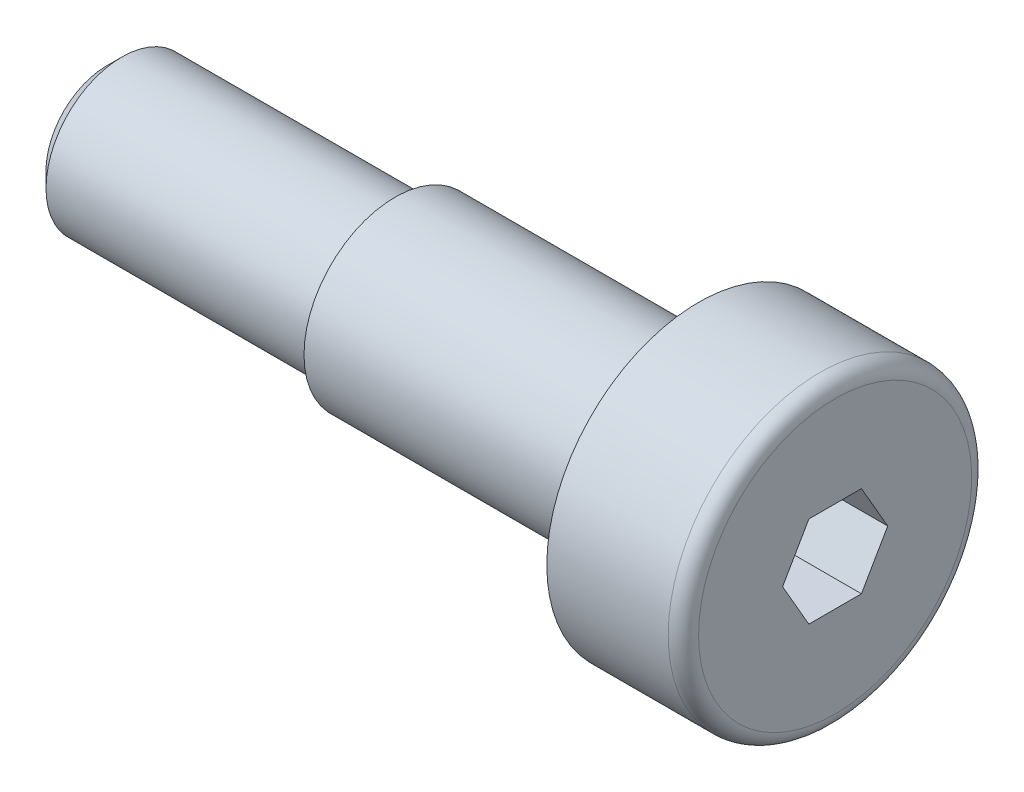
ISO-10303-21;
HEADER;
FILE_DESCRIPTION(('STEP AP214'),'2;1');
FILE_NAME('part.step','',(''),(''),'','','');
FILE_SCHEMA(('AUTOMOTIVE_DESIGN { 1 0 10303 214 1 1 1 1 }'));
ENDSEC;
DATA;
#1=APPLICATION_CONTEXT('core data for automotive mechanical design processes');
#2=APPLICATION_PROTOCOL_DEFINITION('international standard','automotive_design',2000,#1);
#3=PRODUCT_CONTEXT('',#1,'mechanical');
#4=PRODUCT('Part','Part','',(#3));
#5=PRODUCT_RELATED_PRODUCT_CATEGORY('part','',(#4));
#6=PRODUCT_DEFINITION_FORMATION('','',#4);
#7=PRODUCT_DEFINITION_CONTEXT('part definition',#1,'design');
#8=PRODUCT_DEFINITION('design','',#6,#7);
#9=PRODUCT_DEFINITION_SHAPE('','',#8);
#10=(LENGTH_UNIT() NAMED_UNIT(*) SI_UNIT(.MILLI.,.METRE.));
#11=(NAMED_UNIT(*) PLANE_ANGLE_UNIT() SI_UNIT($,.RADIAN.));
#12=(NAMED_UNIT(*) SI_UNIT($,.STERADIAN.) SOLID_ANGLE_UNIT());
#13=UNCERTAINTY_MEASURE_WITH_UNIT(LENGTH_MEASURE(1.E-05),#10,'distance_accuracy_value','');
#14=(GEOMETRIC_REPRESENTATION_CONTEXT(3) GLOBAL_UNCERTAINTY_ASSIGNED_CONTEXT((#13)) GLOBAL_UNIT_ASSIGNED_CONTEXT((#10,
#11,#12)) REPRESENTATION_CONTEXT('',''));
#15=CARTESIAN_POINT('',(0.,0.,0.));
#16=DIRECTION('',(0.,0.,1.));
#17=DIRECTION('',(1.,0.,0.));
#18=AXIS2_PLACEMENT_3D('',#15,#16,#17);
#19=CARTESIAN_POINT('',(0.,0.,0.));
#20=DIRECTION('',(-1.,0.,0.));
#21=DIRECTION('',(0.,0.,1.));
#22=AXIS2_PLACEMENT_3D('',#19,#20,#21);
#23=PLANE('',#22);
#24=DIRECTION('',(0.,0.866025403784439,0.5));
#25=VECTOR('',#24,1.);
#26=CARTESIAN_POINT('',(0.,0.,-1.73205080756888));
#27=LINE('',#26,#25);
#28=CARTESIAN_POINT('',(0.,0.,-1.73205080756888));
#29=VERTEX_POINT('',#28);
#30=CARTESIAN_POINT('',(0.,1.5,-0.866025403784438));
#31=VERTEX_POINT('',#30);
#32=EDGE_CURVE('E124',#29,#31,#27,.T.);
#33=ORIENTED_EDGE('',*,*,#32,.F.);
#34=DIRECTION('',(0.,0.866025403784439,-0.5));
#35=VECTOR('',#34,1.);
#36=CARTESIAN_POINT('',(0.,-1.5,-0.866025403784439));
#37=LINE('',#36,#35);
#38=CARTESIAN_POINT('',(0.,-1.5,-0.866025403784439));
#39=VERTEX_POINT('',#38);
#40=EDGE_CURVE('E50',#39,#29,#37,.T.);
#41=ORIENTED_EDGE('',*,*,#40,.F.);
#42=DIRECTION('',(0.,0.,-1.));
#43=VECTOR('',#42,1.);
#44=CARTESIAN_POINT('',(0.,-1.5,0.866025403784438));
#45=LINE('',#44,#43);
#46=CARTESIAN_POINT('',(0.,-1.5,0.866025403784438));
#47=VERTEX_POINT('',#46);
#48=EDGE_CURVE('E133',#47,#39,#45,.T.);
#49=ORIENTED_EDGE('',*,*,#48,.F.);
#50=DIRECTION('',(0.,-0.866025403784439,-0.5));
#51=VECTOR('',#50,1.);
#52=CARTESIAN_POINT('',(0.,0.,1.73205080756888));
#53=LINE('',#52,#51);
#54=CARTESIAN_POINT('',(0.,0.,1.73205080756888));
#55=VERTEX_POINT('',#54);
#56=EDGE_CURVE('E131',#55,#47,#53,.T.);
#57=ORIENTED_EDGE('',*,*,#56,.F.);
#58=DIRECTION('',(0.,-0.866025403784439,0.5));
#59=VECTOR('',#58,1.);
#60=CARTESIAN_POINT('',(0.,1.5,0.866025403784439));
#61=LINE('',#60,#59);
#62=CARTESIAN_POINT('',(0.,1.5,0.866025403784439));
#63=VERTEX_POINT('',#62);
#64=EDGE_CURVE('E98',#63,#55,#61,.T.);
#65=ORIENTED_EDGE('',*,*,#64,.F.);
#66=DIRECTION('',(0.,0.,1.));
#67=VECTOR('',#66,1.);
#68=CARTESIAN_POINT('',(0.,1.5,-0.866025403784438));
#69=LINE('',#68,#67);
#70=EDGE_CURVE('E127',#31,#63,#69,.T.);
#71=ORIENTED_EDGE('',*,*,#70,.F.);
#72=EDGE_LOOP('',(#33,#41,#49,#57,#65,#71));
#73=FACE_BOUND('',#72,.T.);
#74=CARTESIAN_POINT('',(0.,0.,0.));
#75=DIRECTION('',(-1.,0.,0.));
#76=DIRECTION('',(0.,0.,1.));
#77=AXIS2_PLACEMENT_3D('',#74,#75,#76);
#78=CIRCLE('',#77,4.5);
#79=CARTESIAN_POINT('',(0.,0.,4.5));
#80=VERTEX_POINT('',#79);
#81=EDGE_CURVE('E157',#80,#80,#78,.T.);
#82=ORIENTED_EDGE('',*,*,#81,.F.);
#83=EDGE_LOOP('',(#82));
#84=FACE_BOUND('',#83,.T.);
#85=ADVANCED_FACE('F35',(#73,#84),#23,.F.);
#86=CARTESIAN_POINT('',(-0.5,0.,0.));
#87=DIRECTION('',(-1.,0.,0.));
#88=DIRECTION('',(0.,0.,1.));
#89=AXIS2_PLACEMENT_3D('',#86,#87,#88);
#90=TOROIDAL_SURFACE('',#89,4.5,0.499999999999999);
#91=CARTESIAN_POINT('',(-0.5,0.,0.));
#92=DIRECTION('',(-1.,0.,0.));
#93=DIRECTION('',(0.,0.,1.));
#94=AXIS2_PLACEMENT_3D('',#91,#92,#93);
#95=CIRCLE('',#94,5.);
#96=CARTESIAN_POINT('',(-0.5,0.,5.));
#97=VERTEX_POINT('',#96);
#98=EDGE_CURVE('E154',#97,#97,#95,.T.);
#99=ORIENTED_EDGE('',*,*,#98,.F.);
#100=EDGE_LOOP('',(#99));
#101=FACE_BOUND('',#100,.T.);
#102=ORIENTED_EDGE('',*,*,#81,.T.);
#103=EDGE_LOOP('',(#102));
#104=FACE_BOUND('',#103,.T.);
#105=ADVANCED_FACE('F177',(#101,#104),#90,.T.);
#106=CARTESIAN_POINT('',(0.,0.,0.));
#107=DIRECTION('',(-1.,0.,0.));
#108=DIRECTION('',(0.,0.,1.));
#109=AXIS2_PLACEMENT_3D('',#106,#107,#108);
#110=CYLINDRICAL_SURFACE('',#109,5.);
#111=CARTESIAN_POINT('',(-4.5,0.,0.));
#112=DIRECTION('',(-1.,0.,0.));
#113=DIRECTION('',(0.,0.,1.));
#114=AXIS2_PLACEMENT_3D('',#111,#112,#113);
#115=CIRCLE('',#114,5.);
#116=CARTESIAN_POINT('',(-4.5,0.,5.));
#117=VERTEX_POINT('',#116);
#118=EDGE_CURVE('E151',#117,#117,#115,.T.);
#119=ORIENTED_EDGE('',*,*,#118,.F.);
#120=EDGE_LOOP('',(#119));
#121=FACE_BOUND('',#120,.T.);
#122=ORIENTED_EDGE('',*,*,#98,.T.);
#123=EDGE_LOOP('',(#122));
#124=FACE_BOUND('',#123,.T.);
#125=ADVANCED_FACE('F182',(#121,#124),#110,.T.);
#126=CARTESIAN_POINT('',(-4.5,5.,0.));
#127=DIRECTION('',(1.,0.,0.));
#128=DIRECTION('',(0.,0.,-1.));
#129=AXIS2_PLACEMENT_3D('',#126,#127,#128);
#130=PLANE('',#129);
#131=CARTESIAN_POINT('',(-4.5,0.,0.));
#132=DIRECTION('',(-1.,0.,0.));
#133=DIRECTION('',(0.,0.,1.));
#134=AXIS2_PLACEMENT_3D('',#131,#132,#133);
#135=CIRCLE('',#134,3.);
#136=CARTESIAN_POINT('',(-4.5,0.,3.));
#137=VERTEX_POINT('',#136);
#138=EDGE_CURVE('E148',#137,#137,#135,.T.);
#139=ORIENTED_EDGE('',*,*,#138,.F.);
#140=EDGE_LOOP('',(#139));
#141=FACE_BOUND('',#140,.T.);
#142=ORIENTED_EDGE('',*,*,#118,.T.);
#143=EDGE_LOOP('',(#142));
#144=FACE_BOUND('',#143,.T.);
#145=ADVANCED_FACE('F190',(#141,#144),#130,.F.);
#146=CARTESIAN_POINT('',(0.,0.,0.));
#147=DIRECTION('',(-1.,0.,0.));
#148=DIRECTION('',(0.,0.,1.));
#149=AXIS2_PLACEMENT_3D('',#146,#147,#148);
#150=CYLINDRICAL_SURFACE('',#149,3.);
#151=CARTESIAN_POINT('',(-14.5,0.,0.));
#152=DIRECTION('',(-1.,0.,0.));
#153=DIRECTION('',(0.,0.,1.));
#154=AXIS2_PLACEMENT_3D('',#151,#152,#153);
#155=CIRCLE('',#154,3.);
#156=CARTESIAN_POINT('',(-14.5,0.,3.));
#157=VERTEX_POINT('',#156);
#158=EDGE_CURVE('E145',#157,#157,#155,.T.);
#159=ORIENTED_EDGE('',*,*,#158,.F.);
#160=EDGE_LOOP('',(#159));
#161=FACE_BOUND('',#160,.T.);
#162=ORIENTED_EDGE('',*,*,#138,.T.);
#163=EDGE_LOOP('',(#162));
#164=FACE_BOUND('',#163,.T.);
#165=ADVANCED_FACE('F194',(#161,#164),#150,.T.);
#166=CARTESIAN_POINT('',(-14.5,3.,0.));
#167=DIRECTION('',(1.,0.,0.));
#168=DIRECTION('',(0.,0.,-1.));
#169=AXIS2_PLACEMENT_3D('',#166,#167,#168);
#170=PLANE('',#169);
#171=CARTESIAN_POINT('',(-14.5,0.,0.));
#172=DIRECTION('',(-1.,0.,0.));
#173=DIRECTION('',(0.,0.,1.));
#174=AXIS2_PLACEMENT_3D('',#171,#172,#173);
#175=CIRCLE('',#174,2.5);
#176=CARTESIAN_POINT('',(-14.5,0.,2.5));
#177=VERTEX_POINT('',#176);
#178=EDGE_CURVE('E137',#177,#177,#175,.T.);
#179=ORIENTED_EDGE('',*,*,#178,.F.);
#180=EDGE_LOOP('',(#179));
#181=FACE_BOUND('',#180,.T.);
#182=ORIENTED_EDGE('',*,*,#158,.T.);
#183=EDGE_LOOP('',(#182));
#184=FACE_BOUND('',#183,.T.);
#185=ADVANCED_FACE('F198',(#181,#184),#170,.F.);
#186=CARTESIAN_POINT('',(0.,0.,0.));
#187=DIRECTION('',(-1.,0.,0.));
#188=DIRECTION('',(0.,0.,1.));
#189=AXIS2_PLACEMENT_3D('',#186,#187,#188);
#190=CYLINDRICAL_SURFACE('',#189,2.5);
#191=CARTESIAN_POINT('',(-23.5,0.,0.));
#192=DIRECTION('',(1.,0.,0.));
#193=DIRECTION('',(0.,0.,-1.));
#194=AXIS2_PLACEMENT_3D('',#191,#192,#193);
#195=CIRCLE('',#194,2.5);
#196=CARTESIAN_POINT('',(-23.5,0.,-2.5));
#197=VERTEX_POINT('',#196);
#198=EDGE_CURVE('E11',#197,#197,#195,.T.);
#199=ORIENTED_EDGE('',*,*,#198,.T.);
#200=EDGE_LOOP('',(#199));
#201=FACE_BOUND('',#200,.T.);
#202=ORIENTED_EDGE('',*,*,#178,.T.);
#203=EDGE_LOOP('',(#202));
#204=FACE_BOUND('',#203,.T.);
#205=ADVANCED_FACE('F173',(#201,#204),#190,.T.);
#206=CARTESIAN_POINT('',(-24.,2.5,0.));
#207=DIRECTION('',(1.,0.,0.));
#208=DIRECTION('',(0.,0.,-1.));
#209=AXIS2_PLACEMENT_3D('',#206,#207,#208);
#210=PLANE('',#209);
#211=CARTESIAN_POINT('',(-24.,0.,0.));
#212=DIRECTION('',(1.,0.,0.));
#213=DIRECTION('',(0.,0.,-1.));
#214=AXIS2_PLACEMENT_3D('',#211,#212,#213);
#215=CIRCLE('',#214,2.);
#216=CARTESIAN_POINT('',(-24.,0.,-2.));
#217=VERTEX_POINT('',#216);
#218=EDGE_CURVE('E43',#217,#217,#215,.F.);
#219=ORIENTED_EDGE('',*,*,#218,.T.);
#220=EDGE_LOOP('',(#219));
#221=FACE_BOUND('',#220,.T.);
#222=ADVANCED_FACE('F162',(#221),#210,.F.);
#223=CARTESIAN_POINT('',(-24.,0.,0.));
#224=DIRECTION('',(1.,0.,0.));
#225=DIRECTION('',(0.,0.,-1.));
#226=AXIS2_PLACEMENT_3D('',#223,#224,#225);
#227=CONICAL_SURFACE('',#226,2.,0.785398163397447);
#228=ORIENTED_EDGE('',*,*,#198,.F.);
#229=EDGE_LOOP('',(#228));
#230=FACE_BOUND('',#229,.T.);
#231=ORIENTED_EDGE('',*,*,#218,.F.);
#232=EDGE_LOOP('',(#231));
#233=FACE_BOUND('',#232,.T.);
#234=ADVANCED_FACE('F37',(#230,#233),#227,.T.);
#235=CARTESIAN_POINT('',(-2.4,-1.5,-0.866025403784439));
#236=DIRECTION('',(0.,-0.5,-0.866025403784439));
#237=DIRECTION('',(0.,0.866025403784439,-0.5));
#238=AXIS2_PLACEMENT_3D('',#235,#236,#237);
#239=PLANE('',#238);
#240=ORIENTED_EDGE('',*,*,#40,.T.);
#241=DIRECTION('',(1.,0.,0.));
#242=VECTOR('',#241,1.);
#243=CARTESIAN_POINT('',(-2.4,0.,-1.73205080756888));
#244=LINE('',#243,#242);
#245=CARTESIAN_POINT('',(-2.4,0.,-1.73205080756888));
#246=VERTEX_POINT('',#245);
#247=EDGE_CURVE('E80',#246,#29,#244,.T.);
#248=ORIENTED_EDGE('',*,*,#247,.F.);
#249=DIRECTION('',(0.,0.866025403784439,-0.5));
#250=VECTOR('',#249,1.);
#251=CARTESIAN_POINT('',(-2.4,-1.5,-0.866025403784439));
#252=LINE('',#251,#250);
#253=CARTESIAN_POINT('',(-2.4,-1.5,-0.866025403784439));
#254=VERTEX_POINT('',#253);
#255=EDGE_CURVE('E135',#254,#246,#252,.T.);
#256=ORIENTED_EDGE('',*,*,#255,.F.);
#257=DIRECTION('',(1.,0.,0.));
#258=VECTOR('',#257,1.);
#259=CARTESIAN_POINT('',(-2.4,-1.5,-0.866025403784439));
#260=LINE('',#259,#258);
#261=EDGE_CURVE('E58',#254,#39,#260,.T.);
#262=ORIENTED_EDGE('',*,*,#261,.T.);
#263=EDGE_LOOP('',(#240,#248,#256,#262));
#264=FACE_BOUND('',#263,.T.);
#265=ADVANCED_FACE('F165',(#264),#239,.F.);
#266=CARTESIAN_POINT('',(-2.4,-1.5,0.866025403784438));
#267=DIRECTION('',(0.,-1.,0.));
#268=DIRECTION('',(0.,0.,-1.));
#269=AXIS2_PLACEMENT_3D('',#266,#267,#268);
#270=PLANE('',#269);
#271=ORIENTED_EDGE('',*,*,#48,.T.);
#272=ORIENTED_EDGE('',*,*,#261,.F.);
#273=DIRECTION('',(0.,0.,-1.));
#274=VECTOR('',#273,1.);
#275=CARTESIAN_POINT('',(-2.4,-1.5,0.866025403784438));
#276=LINE('',#275,#274);
#277=CARTESIAN_POINT('',(-2.4,-1.5,0.866025403784438));
#278=VERTEX_POINT('',#277);
#279=EDGE_CURVE('E110',#278,#254,#276,.T.);
#280=ORIENTED_EDGE('',*,*,#279,.F.);
#281=DIRECTION('',(1.,0.,0.));
#282=VECTOR('',#281,1.);
#283=CARTESIAN_POINT('',(-2.4,-1.5,0.866025403784438));
#284=LINE('',#283,#282);
#285=EDGE_CURVE('E102',#278,#47,#284,.T.);
#286=ORIENTED_EDGE('',*,*,#285,.T.);
#287=EDGE_LOOP('',(#271,#272,#280,#286));
#288=FACE_BOUND('',#287,.T.);
#289=ADVANCED_FACE('F171',(#288),#270,.F.);
#290=CARTESIAN_POINT('',(-2.4,0.,1.73205080756888));
#291=DIRECTION('',(0.,-0.5,0.866025403784439));
#292=DIRECTION('',(0.,-0.866025403784439,-0.5));
#293=AXIS2_PLACEMENT_3D('',#290,#291,#292);
#294=PLANE('',#293);
#295=ORIENTED_EDGE('',*,*,#56,.T.);
#296=ORIENTED_EDGE('',*,*,#285,.F.);
#297=DIRECTION('',(0.,-0.866025403784439,-0.5));
#298=VECTOR('',#297,1.);
#299=CARTESIAN_POINT('',(-2.4,0.,1.73205080756888));
#300=LINE('',#299,#298);
#301=CARTESIAN_POINT('',(-2.4,0.,1.73205080756888));
#302=VERTEX_POINT('',#301);
#303=EDGE_CURVE('E106',#302,#278,#300,.T.);
#304=ORIENTED_EDGE('',*,*,#303,.F.);
#305=DIRECTION('',(1.,0.,0.));
#306=VECTOR('',#305,1.);
#307=CARTESIAN_POINT('',(-2.4,0.,1.73205080756888));
#308=LINE('',#307,#306);
#309=EDGE_CURVE('E91',#302,#55,#308,.T.);
#310=ORIENTED_EDGE('',*,*,#309,.T.);
#311=EDGE_LOOP('',(#295,#296,#304,#310));
#312=FACE_BOUND('',#311,.T.);
#313=ADVANCED_FACE('F107',(#312),#294,.F.);
#314=CARTESIAN_POINT('',(-2.4,1.5,0.866025403784439));
#315=DIRECTION('',(0.,0.5,0.866025403784439));
#316=DIRECTION('',(0.,-0.866025403784439,0.5));
#317=AXIS2_PLACEMENT_3D('',#314,#315,#316);
#318=PLANE('',#317);
#319=ORIENTED_EDGE('',*,*,#64,.T.);
#320=ORIENTED_EDGE('',*,*,#309,.F.);
#321=DIRECTION('',(0.,-0.866025403784439,0.5));
#322=VECTOR('',#321,1.);
#323=CARTESIAN_POINT('',(-2.4,1.5,0.866025403784439));
#324=LINE('',#323,#322);
#325=CARTESIAN_POINT('',(-2.4,1.5,0.866025403784439));
#326=VERTEX_POINT('',#325);
#327=EDGE_CURVE('E95',#326,#302,#324,.T.);
#328=ORIENTED_EDGE('',*,*,#327,.F.);
#329=DIRECTION('',(1.,0.,0.));
#330=VECTOR('',#329,1.);
#331=CARTESIAN_POINT('',(-2.4,1.5,0.866025403784439));
#332=LINE('',#331,#330);
#333=EDGE_CURVE('E103',#326,#63,#332,.T.);
#334=ORIENTED_EDGE('',*,*,#333,.T.);
#335=EDGE_LOOP('',(#319,#320,#328,#334));
#336=FACE_BOUND('',#335,.T.);
#337=ADVANCED_FACE('F93',(#336),#318,.F.);
#338=CARTESIAN_POINT('',(-2.4,1.5,-0.866025403784438));
#339=DIRECTION('',(0.,1.,0.));
#340=DIRECTION('',(0.,0.,1.));
#341=AXIS2_PLACEMENT_3D('',#338,#339,#340);
#342=PLANE('',#341);
#343=ORIENTED_EDGE('',*,*,#70,.T.);
#344=ORIENTED_EDGE('',*,*,#333,.F.);
#345=DIRECTION('',(0.,0.,1.));
#346=VECTOR('',#345,1.);
#347=CARTESIAN_POINT('',(-2.4,1.5,-0.866025403784438));
#348=LINE('',#347,#346);
#349=CARTESIAN_POINT('',(-2.4,1.5,-0.866025403784438));
#350=VERTEX_POINT('',#349);
#351=EDGE_CURVE('E116',#350,#326,#348,.T.);
#352=ORIENTED_EDGE('',*,*,#351,.F.);
#353=DIRECTION('',(1.,0.,0.));
#354=VECTOR('',#353,1.);
#355=CARTESIAN_POINT('',(-2.4,1.5,-0.866025403784438));
#356=LINE('',#355,#354);
#357=EDGE_CURVE('E140',#350,#31,#356,.T.);
#358=ORIENTED_EDGE('',*,*,#357,.T.);
#359=EDGE_LOOP('',(#343,#344,#352,#358));
#360=FACE_BOUND('',#359,.T.);
#361=ADVANCED_FACE('F209',(#360),#342,.F.);
#362=CARTESIAN_POINT('',(-2.4,0.,-1.73205080756888));
#363=DIRECTION('',(0.,0.5,-0.866025403784438));
#364=DIRECTION('',(0.,0.866025403784439,0.5));
#365=AXIS2_PLACEMENT_3D('',#362,#363,#364);
#366=PLANE('',#365);
#367=ORIENTED_EDGE('',*,*,#32,.T.);
#368=ORIENTED_EDGE('',*,*,#357,.F.);
#369=DIRECTION('',(0.,0.866025403784439,0.5));
#370=VECTOR('',#369,1.);
#371=CARTESIAN_POINT('',(-2.4,0.,-1.73205080756888));
#372=LINE('',#371,#370);
#373=EDGE_CURVE('E118',#246,#350,#372,.T.);
#374=ORIENTED_EDGE('',*,*,#373,.F.);
#375=ORIENTED_EDGE('',*,*,#247,.T.);
#376=EDGE_LOOP('',(#367,#368,#374,#375));
#377=FACE_BOUND('',#376,.T.);
#378=ADVANCED_FACE('F206',(#377),#366,.F.);
#379=CARTESIAN_POINT('',(-2.4,0.,0.));
#380=DIRECTION('',(1.,0.,0.));
#381=DIRECTION('',(0.,0.,-1.));
#382=AXIS2_PLACEMENT_3D('',#379,#380,#381);
#383=PLANE('',#382);
#384=ORIENTED_EDGE('',*,*,#255,.T.);
#385=ORIENTED_EDGE('',*,*,#373,.T.);
#386=ORIENTED_EDGE('',*,*,#351,.T.);
#387=ORIENTED_EDGE('',*,*,#327,.T.);
#388=ORIENTED_EDGE('',*,*,#303,.T.);
#389=ORIENTED_EDGE('',*,*,#279,.T.);
#390=EDGE_LOOP('',(#384,#385,#386,#387,#388,#389));
#391=FACE_BOUND('',#390,.T.);
#392=ADVANCED_FACE('F113',(#391),#383,.T.);
#393=CLOSED_SHELL('',(#85,#105,#125,#145,#165,#185,#205,#222,#234,#265,#289,#313,#337,#361,#378,#392));
#394=MANIFOLD_SOLID_BREP('B2',#393);
#395=ADVANCED_BREP_SHAPE_REPRESENTATION('',(#18,#394),#14);
#396=SHAPE_DEFINITION_REPRESENTATION(#9,#395);
ENDSEC;
END-ISO-10303-21;
